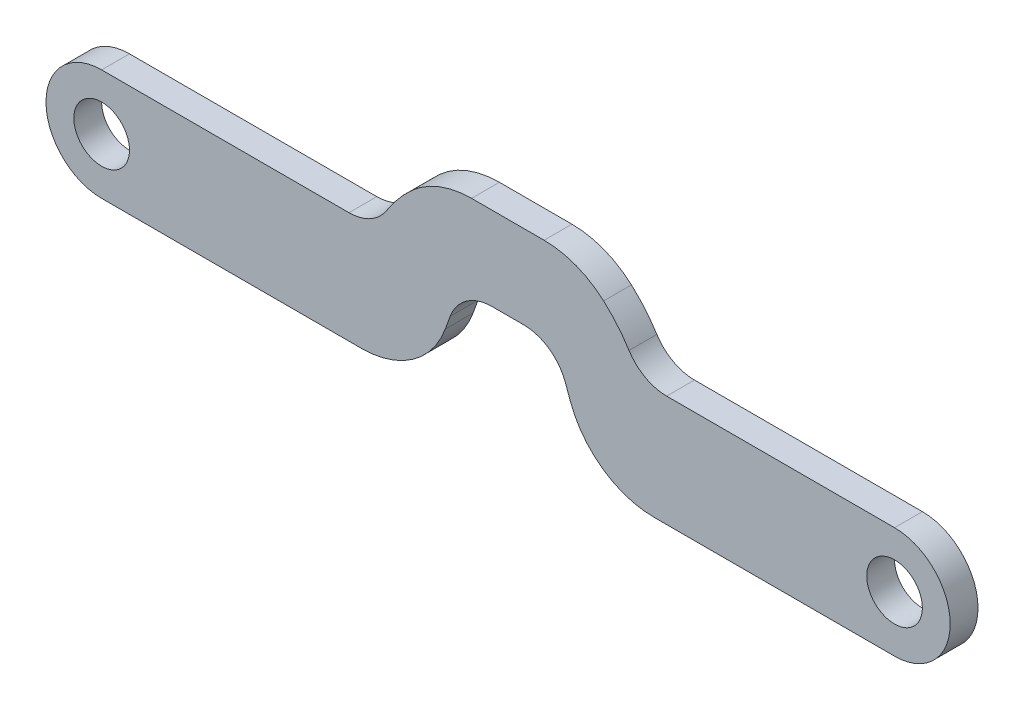
ISO-10303-21;
HEADER;
FILE_DESCRIPTION(('STEP AP214'),'2;1');
FILE_NAME('part.step','',(''),(''),'','','');
FILE_SCHEMA(('AUTOMOTIVE_DESIGN { 1 0 10303 214 1 1 1 1 }'));
ENDSEC;
DATA;
#1=APPLICATION_CONTEXT('core data for automotive mechanical design processes');
#2=APPLICATION_PROTOCOL_DEFINITION('international standard','automotive_design',2000,#1);
#3=PRODUCT_CONTEXT('',#1,'mechanical');
#4=PRODUCT('Part','Part','',(#3));
#5=PRODUCT_RELATED_PRODUCT_CATEGORY('part','',(#4));
#6=PRODUCT_DEFINITION_FORMATION('','',#4);
#7=PRODUCT_DEFINITION_CONTEXT('part definition',#1,'design');
#8=PRODUCT_DEFINITION('design','',#6,#7);
#9=PRODUCT_DEFINITION_SHAPE('','',#8);
#10=(LENGTH_UNIT() NAMED_UNIT(*) SI_UNIT(.MILLI.,.METRE.));
#11=(NAMED_UNIT(*) PLANE_ANGLE_UNIT() SI_UNIT($,.RADIAN.));
#12=(NAMED_UNIT(*) SI_UNIT($,.STERADIAN.) SOLID_ANGLE_UNIT());
#13=UNCERTAINTY_MEASURE_WITH_UNIT(LENGTH_MEASURE(1.E-05),#10,'distance_accuracy_value','');
#14=(GEOMETRIC_REPRESENTATION_CONTEXT(3) GLOBAL_UNCERTAINTY_ASSIGNED_CONTEXT((#13)) GLOBAL_UNIT_ASSIGNED_CONTEXT((#10,
#11,#12)) REPRESENTATION_CONTEXT('',''));
#15=CARTESIAN_POINT('',(0.,0.,0.));
#16=DIRECTION('',(0.,0.,1.));
#17=DIRECTION('',(1.,0.,0.));
#18=AXIS2_PLACEMENT_3D('',#15,#16,#17);
#19=CARTESIAN_POINT('',(0.,-2.,0.5));
#20=DIRECTION('',(0.,1.,0.));
#21=DIRECTION('',(0.,0.,1.));
#22=AXIS2_PLACEMENT_3D('',#19,#20,#21);
#23=PLANE('',#22);
#24=DIRECTION('',(1.,0.,0.));
#25=VECTOR('',#24,1.);
#26=CARTESIAN_POINT('',(0.,-2.,0.5));
#27=LINE('',#26,#25);
#28=CARTESIAN_POINT('',(-8.64341319837332,-2.,0.5));
#29=VERTEX_POINT('',#28);
#30=CARTESIAN_POINT('',(0.,-2.,0.5));
#31=VERTEX_POINT('',#30);
#32=EDGE_CURVE('E177',#29,#31,#27,.T.);
#33=ORIENTED_EDGE('',*,*,#32,.F.);
#34=DIRECTION('',(0.,0.,1.));
#35=VECTOR('',#34,1.);
#36=CARTESIAN_POINT('',(-8.64341319837332,-2.,-0.5));
#37=LINE('',#36,#35);
#38=CARTESIAN_POINT('',(-8.64341319837332,-2.,-0.5));
#39=VERTEX_POINT('',#38);
#40=EDGE_CURVE('E63',#29,#39,#37,.F.);
#41=ORIENTED_EDGE('',*,*,#40,.T.);
#42=DIRECTION('',(1.,0.,0.));
#43=VECTOR('',#42,1.);
#44=CARTESIAN_POINT('',(0.,-2.,-0.5));
#45=LINE('',#44,#43);
#46=CARTESIAN_POINT('',(0.,-2.,-0.5));
#47=VERTEX_POINT('',#46);
#48=EDGE_CURVE('E200',#39,#47,#45,.T.);
#49=ORIENTED_EDGE('',*,*,#48,.T.);
#50=DIRECTION('',(0.,0.,-1.));
#51=VECTOR('',#50,1.);
#52=CARTESIAN_POINT('',(0.,-2.,0.5));
#53=LINE('',#52,#51);
#54=EDGE_CURVE('E195',#31,#47,#53,.T.);
#55=ORIENTED_EDGE('',*,*,#54,.F.);
#56=EDGE_LOOP('',(#33,#41,#49,#55));
#57=FACE_BOUND('',#56,.T.);
#58=ADVANCED_FACE('F40',(#57),#23,.F.);
#59=CARTESIAN_POINT('',(0.,0.,0.5));
#60=DIRECTION('',(0.,0.,1.));
#61=DIRECTION('',(1.,0.,0.));
#62=AXIS2_PLACEMENT_3D('',#59,#60,#61);
#63=PLANE('',#62);
#64=CARTESIAN_POINT('',(-13.9,0.,0.5));
#65=DIRECTION('',(0.,0.,1.));
#66=DIRECTION('',(1.,0.,0.));
#67=AXIS2_PLACEMENT_3D('',#64,#65,#66);
#68=CIRCLE('',#67,5.15);
#69=CARTESIAN_POINT('',(-9.543588377779,2.74666666666667,0.5));
#70=VERTEX_POINT('',#69);
#71=CARTESIAN_POINT('',(-10.4565238577648,3.82948717948718,0.5));
#72=VERTEX_POINT('',#71);
#73=EDGE_CURVE('E354',#70,#72,#68,.T.);
#74=ORIENTED_EDGE('',*,*,#73,.T.);
#75=CARTESIAN_POINT('',(-12.5961595189595,1.45,0.5));
#76=DIRECTION('',(0.,0.,1.));
#77=DIRECTION('',(1.,0.,0.));
#78=AXIS2_PLACEMENT_3D('',#75,#76,#77);
#79=CIRCLE('',#78,3.2);
#80=CARTESIAN_POINT('',(-12.5961595189595,4.65,0.5));
#81=VERTEX_POINT('',#80);
#82=EDGE_CURVE('E253',#72,#81,#79,.T.);
#83=ORIENTED_EDGE('',*,*,#82,.T.);
#84=DIRECTION('',(-1.,0.,0.));
#85=VECTOR('',#84,1.);
#86=CARTESIAN_POINT('',(0.,4.65,0.5));
#87=LINE('',#86,#85);
#88=CARTESIAN_POINT('',(-15.2038404810405,4.65,0.5));
#89=VERTEX_POINT('',#88);
#90=EDGE_CURVE('E346',#81,#89,#87,.T.);
#91=ORIENTED_EDGE('',*,*,#90,.T.);
#92=CARTESIAN_POINT('',(-15.2038404810405,1.45,0.5));
#93=DIRECTION('',(0.,0.,1.));
#94=DIRECTION('',(1.,0.,0.));
#95=AXIS2_PLACEMENT_3D('',#92,#93,#94);
#96=CIRCLE('',#95,3.2);
#97=CARTESIAN_POINT('',(-17.3434761422352,3.82948717948718,0.5));
#98=VERTEX_POINT('',#97);
#99=EDGE_CURVE('E251',#89,#98,#96,.T.);
#100=ORIENTED_EDGE('',*,*,#99,.T.);
#101=CARTESIAN_POINT('',(-18.256411622221,2.74666666666667,0.5));
#102=VERTEX_POINT('',#101);
#103=EDGE_CURVE('E355',#98,#102,#68,.T.);
#104=ORIENTED_EDGE('',*,*,#103,.T.);
#105=CARTESIAN_POINT('',(-19.6098598932023,3.6,0.5));
#106=DIRECTION('',(0.,0.,1.));
#107=DIRECTION('',(1.,0.,0.));
#108=AXIS2_PLACEMENT_3D('',#105,#106,#107);
#109=CIRCLE('',#108,1.6);
#110=CARTESIAN_POINT('',(-19.6098598932023,2.,0.5));
#111=VERTEX_POINT('',#110);
#112=EDGE_CURVE('E243',#102,#111,#109,.F.);
#113=ORIENTED_EDGE('',*,*,#112,.T.);
#114=DIRECTION('',(1.,0.,0.));
#115=VECTOR('',#114,1.);
#116=CARTESIAN_POINT('',(0.,2.,0.5));
#117=LINE('',#116,#115);
#118=CARTESIAN_POINT('',(-28.5003,2.,0.5));
#119=VERTEX_POINT('',#118);
#120=EDGE_CURVE('E294',#119,#111,#117,.T.);
#121=ORIENTED_EDGE('',*,*,#120,.F.);
#122=CARTESIAN_POINT('',(-28.5003,0.,0.5));
#123=DIRECTION('',(0.,0.,1.));
#124=DIRECTION('',(1.,0.,0.));
#125=AXIS2_PLACEMENT_3D('',#122,#123,#124);
#126=CIRCLE('',#125,2.);
#127=CARTESIAN_POINT('',(-28.5003,-2.,0.5));
#128=VERTEX_POINT('',#127);
#129=EDGE_CURVE('E288',#119,#128,#126,.T.);
#130=ORIENTED_EDGE('',*,*,#129,.T.);
#131=CARTESIAN_POINT('',(-19.1565868016267,-2.,0.5));
#132=VERTEX_POINT('',#131);
#133=EDGE_CURVE('E188',#128,#132,#27,.T.);
#134=ORIENTED_EDGE('',*,*,#133,.T.);
#135=CARTESIAN_POINT('',(-19.1565868016267,1.2,0.5));
#136=DIRECTION('',(0.,0.,1.));
#137=DIRECTION('',(1.,0.,0.));
#138=AXIS2_PLACEMENT_3D('',#135,#136,#137);
#139=CIRCLE('',#138,3.2);
#140=CARTESIAN_POINT('',(-16.1495704151118,0.105535541357851,0.5));
#141=VERTEX_POINT('',#140);
#142=EDGE_CURVE('E248',#132,#141,#139,.T.);
#143=ORIENTED_EDGE('',*,*,#142,.T.);
#144=DIRECTION('',(-0.342020143325671,-0.939692620785908,0.));
#145=VECTOR('',#144,1.);
#146=CARTESIAN_POINT('',(-14.2943480143666,5.20271719547167,0.5));
#147=LINE('',#146,#145);
#148=CARTESIAN_POINT('',(-15.9706074564059,0.59723222932107,0.5));
#149=VERTEX_POINT('',#148);
#150=EDGE_CURVE('E429',#149,#141,#147,.T.);
#151=ORIENTED_EDGE('',*,*,#150,.F.);
#152=CARTESIAN_POINT('',(-14.4670992631484,0.0499999999999962,0.5));
#153=DIRECTION('',(0.,0.,1.));
#154=DIRECTION('',(1.,0.,0.));
#155=AXIS2_PLACEMENT_3D('',#152,#153,#154);
#156=CIRCLE('',#155,1.6);
#157=CARTESIAN_POINT('',(-14.4670992631484,1.65,0.5));
#158=VERTEX_POINT('',#157);
#159=EDGE_CURVE('E232',#149,#158,#156,.F.);
#160=ORIENTED_EDGE('',*,*,#159,.T.);
#161=DIRECTION('',(1.,0.,0.));
#162=VECTOR('',#161,1.);
#163=CARTESIAN_POINT('',(0.,1.65,0.5));
#164=LINE('',#163,#162);
#165=CARTESIAN_POINT('',(-13.3329007368516,1.65,0.5));
#166=VERTEX_POINT('',#165);
#167=EDGE_CURVE('E435',#158,#166,#164,.T.);
#168=ORIENTED_EDGE('',*,*,#167,.T.);
#169=CARTESIAN_POINT('',(-13.3329007368516,0.0499999999999964,0.5));
#170=DIRECTION('',(0.,0.,1.));
#171=DIRECTION('',(1.,0.,0.));
#172=AXIS2_PLACEMENT_3D('',#169,#170,#171);
#173=CIRCLE('',#172,1.6);
#174=CARTESIAN_POINT('',(-11.8293925435941,0.597232229321065,0.5));
#175=VERTEX_POINT('',#174);
#176=EDGE_CURVE('E228',#166,#175,#173,.F.);
#177=ORIENTED_EDGE('',*,*,#176,.T.);
#178=DIRECTION('',(0.342020143325668,-0.939692620785909,0.));
#179=VECTOR('',#178,1.);
#180=CARTESIAN_POINT('',(-10.2536697449872,-3.73203057917125,0.5));
#181=LINE('',#180,#179);
#182=CARTESIAN_POINT('',(-11.6504295848882,0.105535541357863,0.5));
#183=VERTEX_POINT('',#182);
#184=EDGE_CURVE('E351',#175,#183,#181,.T.);
#185=ORIENTED_EDGE('',*,*,#184,.T.);
#186=CARTESIAN_POINT('',(-8.64341319837332,1.2,0.5));
#187=DIRECTION('',(0.,0.,1.));
#188=DIRECTION('',(1.,0.,0.));
#189=AXIS2_PLACEMENT_3D('',#186,#187,#188);
#190=CIRCLE('',#189,3.2);
#191=EDGE_CURVE('E186',#183,#29,#190,.T.);
#192=ORIENTED_EDGE('',*,*,#191,.T.);
#193=ORIENTED_EDGE('',*,*,#32,.T.);
#194=CARTESIAN_POINT('',(0.,0.,0.5));
#195=DIRECTION('',(0.,0.,1.));
#196=DIRECTION('',(1.,0.,0.));
#197=AXIS2_PLACEMENT_3D('',#194,#195,#196);
#198=CIRCLE('',#197,2.);
#199=CARTESIAN_POINT('',(0.,2.,0.5));
#200=VERTEX_POINT('',#199);
#201=EDGE_CURVE('E183',#31,#200,#198,.T.);
#202=ORIENTED_EDGE('',*,*,#201,.T.);
#203=CARTESIAN_POINT('',(-8.19014010679772,2.,0.5));
#204=VERTEX_POINT('',#203);
#205=EDGE_CURVE('E198',#204,#200,#117,.T.);
#206=ORIENTED_EDGE('',*,*,#205,.F.);
#207=CARTESIAN_POINT('',(-8.19014010679772,3.6,0.5));
#208=DIRECTION('',(0.,0.,1.));
#209=DIRECTION('',(1.,0.,0.));
#210=AXIS2_PLACEMENT_3D('',#207,#208,#209);
#211=CIRCLE('',#210,1.6);
#212=EDGE_CURVE('E236',#204,#70,#211,.F.);
#213=ORIENTED_EDGE('',*,*,#212,.T.);
#214=EDGE_LOOP('',(#74,#83,#91,#100,#104,#113,#121,#130,#134,#143,#151,#160,#168,#177,#185,#192,
#193,#202,#206,#213));
#215=FACE_BOUND('',#214,.T.);
#216=CARTESIAN_POINT('',(0.,0.,0.5));
#217=DIRECTION('',(0.,0.,1.));
#218=DIRECTION('',(1.,0.,0.));
#219=AXIS2_PLACEMENT_3D('',#216,#217,#218);
#220=CIRCLE('',#219,1.);
#221=CARTESIAN_POINT('',(1.,0.,0.5));
#222=VERTEX_POINT('',#221);
#223=EDGE_CURVE('E301',#222,#222,#220,.T.);
#224=ORIENTED_EDGE('',*,*,#223,.F.);
#225=EDGE_LOOP('',(#224));
#226=FACE_BOUND('',#225,.T.);
#227=CARTESIAN_POINT('',(-28.5003,0.,0.5));
#228=DIRECTION('',(0.,0.,1.));
#229=DIRECTION('',(1.,0.,0.));
#230=AXIS2_PLACEMENT_3D('',#227,#228,#229);
#231=CIRCLE('',#230,0.999999999999998);
#232=CARTESIAN_POINT('',(-27.5003,0.,0.5));
#233=VERTEX_POINT('',#232);
#234=EDGE_CURVE('E298',#233,#233,#231,.T.);
#235=ORIENTED_EDGE('',*,*,#234,.F.);
#236=EDGE_LOOP('',(#235));
#237=FACE_BOUND('',#236,.T.);
#238=ADVANCED_FACE('F180',(#215,#226,#237),#63,.T.);
#239=CARTESIAN_POINT('',(0.,0.,-0.5));
#240=DIRECTION('',(0.,0.,1.));
#241=DIRECTION('',(1.,0.,0.));
#242=AXIS2_PLACEMENT_3D('',#239,#240,#241);
#243=PLANE('',#242);
#244=CARTESIAN_POINT('',(-28.5003,0.,-0.5));
#245=DIRECTION('',(0.,0.,1.));
#246=DIRECTION('',(1.,0.,0.));
#247=AXIS2_PLACEMENT_3D('',#244,#245,#246);
#248=CIRCLE('',#247,0.999999999999998);
#249=CARTESIAN_POINT('',(-27.5003,0.,-0.5));
#250=VERTEX_POINT('',#249);
#251=EDGE_CURVE('E314',#250,#250,#248,.T.);
#252=ORIENTED_EDGE('',*,*,#251,.T.);
#253=EDGE_LOOP('',(#252));
#254=FACE_BOUND('',#253,.T.);
#255=CARTESIAN_POINT('',(0.,0.,-0.5));
#256=DIRECTION('',(0.,0.,1.));
#257=DIRECTION('',(1.,0.,0.));
#258=AXIS2_PLACEMENT_3D('',#255,#256,#257);
#259=CIRCLE('',#258,1.);
#260=CARTESIAN_POINT('',(1.,0.,-0.5));
#261=VERTEX_POINT('',#260);
#262=EDGE_CURVE('E189',#261,#261,#259,.T.);
#263=ORIENTED_EDGE('',*,*,#262,.T.);
#264=EDGE_LOOP('',(#263));
#265=FACE_BOUND('',#264,.T.);
#266=DIRECTION('',(-1.,0.,0.));
#267=VECTOR('',#266,1.);
#268=CARTESIAN_POINT('',(0.,4.65,-0.5));
#269=LINE('',#268,#267);
#270=CARTESIAN_POINT('',(-12.5961595189595,4.65,-0.5));
#271=VERTEX_POINT('',#270);
#272=CARTESIAN_POINT('',(-15.2038404810405,4.65,-0.5));
#273=VERTEX_POINT('',#272);
#274=EDGE_CURVE('E348',#271,#273,#269,.T.);
#275=ORIENTED_EDGE('',*,*,#274,.F.);
#276=CARTESIAN_POINT('',(-12.5961595189595,1.45,-0.5));
#277=DIRECTION('',(0.,0.,1.));
#278=DIRECTION('',(1.,0.,0.));
#279=AXIS2_PLACEMENT_3D('',#276,#277,#278);
#280=CIRCLE('',#279,3.2);
#281=CARTESIAN_POINT('',(-10.4565238577648,3.82948717948718,-0.5));
#282=VERTEX_POINT('',#281);
#283=EDGE_CURVE('E265',#271,#282,#280,.F.);
#284=ORIENTED_EDGE('',*,*,#283,.T.);
#285=CARTESIAN_POINT('',(-13.9,0.,-0.5));
#286=DIRECTION('',(0.,0.,1.));
#287=DIRECTION('',(1.,0.,0.));
#288=AXIS2_PLACEMENT_3D('',#285,#286,#287);
#289=CIRCLE('',#288,5.15);
#290=CARTESIAN_POINT('',(-9.543588377779,2.74666666666667,-0.5));
#291=VERTEX_POINT('',#290);
#292=EDGE_CURVE('E291',#291,#282,#289,.T.);
#293=ORIENTED_EDGE('',*,*,#292,.F.);
#294=CARTESIAN_POINT('',(-8.19014010679772,3.6,-0.5));
#295=DIRECTION('',(0.,0.,1.));
#296=DIRECTION('',(1.,0.,0.));
#297=AXIS2_PLACEMENT_3D('',#294,#295,#296);
#298=CIRCLE('',#297,1.6);
#299=CARTESIAN_POINT('',(-8.19014010679772,2.,-0.5));
#300=VERTEX_POINT('',#299);
#301=EDGE_CURVE('E238',#291,#300,#298,.T.);
#302=ORIENTED_EDGE('',*,*,#301,.T.);
#303=DIRECTION('',(1.,0.,0.));
#304=VECTOR('',#303,1.);
#305=CARTESIAN_POINT('',(0.,2.,-0.5));
#306=LINE('',#305,#304);
#307=CARTESIAN_POINT('',(0.,2.,-0.5));
#308=VERTEX_POINT('',#307);
#309=EDGE_CURVE('E308',#300,#308,#306,.T.);
#310=ORIENTED_EDGE('',*,*,#309,.T.);
#311=CARTESIAN_POINT('',(0.,0.,-0.5));
#312=DIRECTION('',(0.,0.,1.));
#313=DIRECTION('',(1.,0.,0.));
#314=AXIS2_PLACEMENT_3D('',#311,#312,#313);
#315=CIRCLE('',#314,2.);
#316=EDGE_CURVE('E306',#47,#308,#315,.T.);
#317=ORIENTED_EDGE('',*,*,#316,.F.);
#318=ORIENTED_EDGE('',*,*,#48,.F.);
#319=CARTESIAN_POINT('',(-8.64341319837332,1.2,-0.5));
#320=DIRECTION('',(0.,0.,1.));
#321=DIRECTION('',(1.,0.,0.));
#322=AXIS2_PLACEMENT_3D('',#319,#320,#321);
#323=CIRCLE('',#322,3.2);
#324=CARTESIAN_POINT('',(-11.6504295848882,0.105535541357863,-0.5));
#325=VERTEX_POINT('',#324);
#326=EDGE_CURVE('E55',#39,#325,#323,.F.);
#327=ORIENTED_EDGE('',*,*,#326,.T.);
#328=DIRECTION('',(0.342020143325668,-0.939692620785909,0.));
#329=VECTOR('',#328,1.);
#330=CARTESIAN_POINT('',(-10.2536697449872,-3.73203057917125,-0.5));
#331=LINE('',#330,#329);
#332=CARTESIAN_POINT('',(-11.8293925435941,0.597232229321065,-0.5));
#333=VERTEX_POINT('',#332);
#334=EDGE_CURVE('E434',#333,#325,#331,.T.);
#335=ORIENTED_EDGE('',*,*,#334,.F.);
#336=CARTESIAN_POINT('',(-13.3329007368516,0.0499999999999964,-0.5));
#337=DIRECTION('',(0.,0.,1.));
#338=DIRECTION('',(1.,0.,0.));
#339=AXIS2_PLACEMENT_3D('',#336,#337,#338);
#340=CIRCLE('',#339,1.6);
#341=CARTESIAN_POINT('',(-13.3329007368516,1.65,-0.5));
#342=VERTEX_POINT('',#341);
#343=EDGE_CURVE('E230',#333,#342,#340,.T.);
#344=ORIENTED_EDGE('',*,*,#343,.T.);
#345=DIRECTION('',(1.,0.,0.));
#346=VECTOR('',#345,1.);
#347=CARTESIAN_POINT('',(0.,1.65,-0.5));
#348=LINE('',#347,#346);
#349=CARTESIAN_POINT('',(-14.4670992631484,1.65,-0.5));
#350=VERTEX_POINT('',#349);
#351=EDGE_CURVE('E438',#350,#342,#348,.T.);
#352=ORIENTED_EDGE('',*,*,#351,.F.);
#353=CARTESIAN_POINT('',(-14.4670992631484,0.0499999999999962,-0.5));
#354=DIRECTION('',(0.,0.,1.));
#355=DIRECTION('',(1.,0.,0.));
#356=AXIS2_PLACEMENT_3D('',#353,#354,#355);
#357=CIRCLE('',#356,1.6);
#358=CARTESIAN_POINT('',(-15.9706074564059,0.59723222932107,-0.5));
#359=VERTEX_POINT('',#358);
#360=EDGE_CURVE('E234',#350,#359,#357,.T.);
#361=ORIENTED_EDGE('',*,*,#360,.T.);
#362=DIRECTION('',(-0.342020143325671,-0.939692620785908,0.));
#363=VECTOR('',#362,1.);
#364=CARTESIAN_POINT('',(-14.2943480143666,5.20271719547167,-0.5));
#365=LINE('',#364,#363);
#366=CARTESIAN_POINT('',(-16.1495704151118,0.105535541357851,-0.5));
#367=VERTEX_POINT('',#366);
#368=EDGE_CURVE('E337',#359,#367,#365,.T.);
#369=ORIENTED_EDGE('',*,*,#368,.T.);
#370=CARTESIAN_POINT('',(-19.1565868016267,1.2,-0.5));
#371=DIRECTION('',(0.,0.,1.));
#372=DIRECTION('',(1.,0.,0.));
#373=AXIS2_PLACEMENT_3D('',#370,#371,#372);
#374=CIRCLE('',#373,3.2);
#375=CARTESIAN_POINT('',(-19.1565868016267,-2.,-0.5));
#376=VERTEX_POINT('',#375);
#377=EDGE_CURVE('E260',#367,#376,#374,.F.);
#378=ORIENTED_EDGE('',*,*,#377,.T.);
#379=CARTESIAN_POINT('',(-28.5003,-2.,-0.5));
#380=VERTEX_POINT('',#379);
#381=EDGE_CURVE('E281',#380,#376,#45,.T.);
#382=ORIENTED_EDGE('',*,*,#381,.F.);
#383=CARTESIAN_POINT('',(-28.5003,0.,-0.5));
#384=DIRECTION('',(0.,0.,1.));
#385=DIRECTION('',(1.,0.,0.));
#386=AXIS2_PLACEMENT_3D('',#383,#384,#385);
#387=CIRCLE('',#386,2.);
#388=CARTESIAN_POINT('',(-28.5003,2.,-0.5));
#389=VERTEX_POINT('',#388);
#390=EDGE_CURVE('E312',#389,#380,#387,.T.);
#391=ORIENTED_EDGE('',*,*,#390,.F.);
#392=CARTESIAN_POINT('',(-19.6098598932023,2.,-0.5));
#393=VERTEX_POINT('',#392);
#394=EDGE_CURVE('E309',#389,#393,#306,.T.);
#395=ORIENTED_EDGE('',*,*,#394,.T.);
#396=CARTESIAN_POINT('',(-19.6098598932023,3.6,-0.5));
#397=DIRECTION('',(0.,0.,1.));
#398=DIRECTION('',(1.,0.,0.));
#399=AXIS2_PLACEMENT_3D('',#396,#397,#398);
#400=CIRCLE('',#399,1.6);
#401=CARTESIAN_POINT('',(-18.256411622221,2.74666666666667,-0.5));
#402=VERTEX_POINT('',#401);
#403=EDGE_CURVE('E240',#393,#402,#400,.T.);
#404=ORIENTED_EDGE('',*,*,#403,.T.);
#405=CARTESIAN_POINT('',(-17.3434761422352,3.82948717948718,-0.5));
#406=VERTEX_POINT('',#405);
#407=EDGE_CURVE('E333',#406,#402,#289,.T.);
#408=ORIENTED_EDGE('',*,*,#407,.F.);
#409=CARTESIAN_POINT('',(-15.2038404810405,1.45,-0.5));
#410=DIRECTION('',(0.,0.,1.));
#411=DIRECTION('',(1.,0.,0.));
#412=AXIS2_PLACEMENT_3D('',#409,#410,#411);
#413=CIRCLE('',#412,3.2);
#414=EDGE_CURVE('E263',#406,#273,#413,.F.);
#415=ORIENTED_EDGE('',*,*,#414,.T.);
#416=EDGE_LOOP('',(#275,#284,#293,#302,#310,#317,#318,#327,#335,#344,#352,#361,#369,#378,#382,
#391,#395,#404,#408,#415));
#417=FACE_BOUND('',#416,.T.);
#418=ADVANCED_FACE('F325',(#254,#265,#417),#243,.F.);
#419=CARTESIAN_POINT('',(-13.9,0.,0.5));
#420=DIRECTION('',(0.,0.,-1.));
#421=DIRECTION('',(-1.,0.,0.));
#422=AXIS2_PLACEMENT_3D('',#419,#420,#421);
#423=CYLINDRICAL_SURFACE('',#422,5.15);
#424=ORIENTED_EDGE('',*,*,#292,.T.);
#425=DIRECTION('',(0.,0.,-1.));
#426=VECTOR('',#425,1.);
#427=CARTESIAN_POINT('',(-10.4565238577648,3.82948717948718,0.5));
#428=LINE('',#427,#426);
#429=EDGE_CURVE('E245',#282,#72,#428,.F.);
#430=ORIENTED_EDGE('',*,*,#429,.T.);
#431=ORIENTED_EDGE('',*,*,#73,.F.);
#432=DIRECTION('',(0.,0.,-1.));
#433=VECTOR('',#432,1.);
#434=CARTESIAN_POINT('',(-9.543588377779,2.74666666666667,0.5));
#435=LINE('',#434,#433);
#436=EDGE_CURVE('E220',#70,#291,#435,.T.);
#437=ORIENTED_EDGE('',*,*,#436,.T.);
#438=EDGE_LOOP('',(#424,#430,#431,#437));
#439=FACE_BOUND('',#438,.T.);
#440=ADVANCED_FACE('F361',(#439),#423,.T.);
#441=ORIENTED_EDGE('',*,*,#103,.F.);
#442=DIRECTION('',(0.,0.,-1.));
#443=VECTOR('',#442,1.);
#444=CARTESIAN_POINT('',(-17.3434761422352,3.82948717948718,0.5));
#445=LINE('',#444,#443);
#446=EDGE_CURVE('E267',#98,#406,#445,.T.);
#447=ORIENTED_EDGE('',*,*,#446,.T.);
#448=ORIENTED_EDGE('',*,*,#407,.T.);
#449=DIRECTION('',(0.,0.,-1.));
#450=VECTOR('',#449,1.);
#451=CARTESIAN_POINT('',(-18.256411622221,2.74666666666667,0.5));
#452=LINE('',#451,#450);
#453=EDGE_CURVE('E225',#402,#102,#452,.F.);
#454=ORIENTED_EDGE('',*,*,#453,.T.);
#455=EDGE_LOOP('',(#441,#447,#448,#454));
#456=FACE_BOUND('',#455,.T.);
#457=ADVANCED_FACE('F396',(#456),#423,.T.);
#458=CARTESIAN_POINT('',(0.,2.,0.5));
#459=DIRECTION('',(0.,1.,0.));
#460=DIRECTION('',(0.,0.,1.));
#461=AXIS2_PLACEMENT_3D('',#458,#459,#460);
#462=PLANE('',#461);
#463=ORIENTED_EDGE('',*,*,#309,.F.);
#464=DIRECTION('',(0.,0.,-1.));
#465=VECTOR('',#464,1.);
#466=CARTESIAN_POINT('',(-8.19014010679772,2.,0.5));
#467=LINE('',#466,#465);
#468=EDGE_CURVE('E217',#300,#204,#467,.F.);
#469=ORIENTED_EDGE('',*,*,#468,.T.);
#470=ORIENTED_EDGE('',*,*,#205,.T.);
#471=DIRECTION('',(0.,0.,-1.));
#472=VECTOR('',#471,1.);
#473=CARTESIAN_POINT('',(0.,2.,0.5));
#474=LINE('',#473,#472);
#475=EDGE_CURVE('E197',#200,#308,#474,.T.);
#476=ORIENTED_EDGE('',*,*,#475,.T.);
#477=EDGE_LOOP('',(#463,#469,#470,#476));
#478=FACE_BOUND('',#477,.T.);
#479=ADVANCED_FACE('F391',(#478),#462,.T.);
#480=ORIENTED_EDGE('',*,*,#120,.T.);
#481=DIRECTION('',(0.,0.,-1.));
#482=VECTOR('',#481,1.);
#483=CARTESIAN_POINT('',(-19.6098598932023,2.,0.5));
#484=LINE('',#483,#482);
#485=EDGE_CURVE('E222',#111,#393,#484,.T.);
#486=ORIENTED_EDGE('',*,*,#485,.T.);
#487=ORIENTED_EDGE('',*,*,#394,.F.);
#488=DIRECTION('',(0.,0.,-1.));
#489=VECTOR('',#488,1.);
#490=CARTESIAN_POINT('',(-28.5003,2.,0.5));
#491=LINE('',#490,#489);
#492=EDGE_CURVE('E206',#119,#389,#491,.T.);
#493=ORIENTED_EDGE('',*,*,#492,.F.);
#494=EDGE_LOOP('',(#480,#486,#487,#493));
#495=FACE_BOUND('',#494,.T.);
#496=ADVANCED_FACE('F326',(#495),#462,.T.);
#497=ORIENTED_EDGE('',*,*,#381,.T.);
#498=DIRECTION('',(0.,0.,1.));
#499=VECTOR('',#498,1.);
#500=CARTESIAN_POINT('',(-19.1565868016267,-2.,0.5));
#501=LINE('',#500,#499);
#502=EDGE_CURVE('E48',#376,#132,#501,.T.);
#503=ORIENTED_EDGE('',*,*,#502,.T.);
#504=ORIENTED_EDGE('',*,*,#133,.F.);
#505=DIRECTION('',(0.,0.,-1.));
#506=VECTOR('',#505,1.);
#507=CARTESIAN_POINT('',(-28.5003,-2.,0.5));
#508=LINE('',#507,#506);
#509=EDGE_CURVE('E304',#128,#380,#508,.T.);
#510=ORIENTED_EDGE('',*,*,#509,.T.);
#511=EDGE_LOOP('',(#497,#503,#504,#510));
#512=FACE_BOUND('',#511,.T.);
#513=ADVANCED_FACE('F278',(#512),#23,.F.);
#514=CARTESIAN_POINT('',(0.,0.,0.5));
#515=DIRECTION('',(0.,0.,-1.));
#516=DIRECTION('',(-1.,0.,0.));
#517=AXIS2_PLACEMENT_3D('',#514,#515,#516);
#518=CYLINDRICAL_SURFACE('',#517,2.);
#519=ORIENTED_EDGE('',*,*,#316,.T.);
#520=ORIENTED_EDGE('',*,*,#475,.F.);
#521=ORIENTED_EDGE('',*,*,#201,.F.);
#522=ORIENTED_EDGE('',*,*,#54,.T.);
#523=EDGE_LOOP('',(#519,#520,#521,#522));
#524=FACE_BOUND('',#523,.T.);
#525=ADVANCED_FACE('F194',(#524),#518,.T.);
#526=CARTESIAN_POINT('',(-28.5003,0.,0.5));
#527=DIRECTION('',(0.,0.,-1.));
#528=DIRECTION('',(-1.,0.,0.));
#529=AXIS2_PLACEMENT_3D('',#526,#527,#528);
#530=CYLINDRICAL_SURFACE('',#529,0.999999999999998);
#531=ORIENTED_EDGE('',*,*,#234,.T.);
#532=EDGE_LOOP('',(#531));
#533=FACE_BOUND('',#532,.T.);
#534=ORIENTED_EDGE('',*,*,#251,.F.);
#535=EDGE_LOOP('',(#534));
#536=FACE_BOUND('',#535,.T.);
#537=ADVANCED_FACE('F390',(#533,#536),#530,.F.);
#538=CARTESIAN_POINT('',(-28.5003,0.,0.5));
#539=DIRECTION('',(0.,0.,-1.));
#540=DIRECTION('',(-1.,0.,0.));
#541=AXIS2_PLACEMENT_3D('',#538,#539,#540);
#542=CYLINDRICAL_SURFACE('',#541,2.);
#543=ORIENTED_EDGE('',*,*,#390,.T.);
#544=ORIENTED_EDGE('',*,*,#509,.F.);
#545=ORIENTED_EDGE('',*,*,#129,.F.);
#546=ORIENTED_EDGE('',*,*,#492,.T.);
#547=EDGE_LOOP('',(#543,#544,#545,#546));
#548=FACE_BOUND('',#547,.T.);
#549=ADVANCED_FACE('F321',(#548),#542,.T.);
#550=CARTESIAN_POINT('',(0.,0.,0.5));
#551=DIRECTION('',(0.,0.,-1.));
#552=DIRECTION('',(-1.,0.,0.));
#553=AXIS2_PLACEMENT_3D('',#550,#551,#552);
#554=CYLINDRICAL_SURFACE('',#553,1.);
#555=ORIENTED_EDGE('',*,*,#223,.T.);
#556=EDGE_LOOP('',(#555));
#557=FACE_BOUND('',#556,.T.);
#558=ORIENTED_EDGE('',*,*,#262,.F.);
#559=EDGE_LOOP('',(#558));
#560=FACE_BOUND('',#559,.T.);
#561=ADVANCED_FACE('F401',(#557,#560),#554,.F.);
#562=CARTESIAN_POINT('',(0.,4.65,-0.5));
#563=DIRECTION('',(0.,1.,0.));
#564=DIRECTION('',(0.,0.,1.));
#565=AXIS2_PLACEMENT_3D('',#562,#563,#564);
#566=PLANE('',#565);
#567=ORIENTED_EDGE('',*,*,#90,.F.);
#568=DIRECTION('',(0.,0.,1.));
#569=VECTOR('',#568,1.);
#570=CARTESIAN_POINT('',(-12.5961595189595,4.65,-0.5));
#571=LINE('',#570,#569);
#572=EDGE_CURVE('E258',#81,#271,#571,.F.);
#573=ORIENTED_EDGE('',*,*,#572,.T.);
#574=ORIENTED_EDGE('',*,*,#274,.T.);
#575=DIRECTION('',(0.,0.,1.));
#576=VECTOR('',#575,1.);
#577=CARTESIAN_POINT('',(-15.2038404810405,4.65,0.5));
#578=LINE('',#577,#576);
#579=EDGE_CURVE('E255',#273,#89,#578,.T.);
#580=ORIENTED_EDGE('',*,*,#579,.T.);
#581=EDGE_LOOP('',(#567,#573,#574,#580));
#582=FACE_BOUND('',#581,.T.);
#583=ADVANCED_FACE('F345',(#582),#566,.T.);
#584=CARTESIAN_POINT('',(-14.2943480143666,5.20271719547167,-0.5));
#585=DIRECTION('',(-0.939692620785908,0.342020143325671,0.));
#586=DIRECTION('',(-0.342020143325671,-0.939692620785908,0.));
#587=AXIS2_PLACEMENT_3D('',#584,#585,#586);
#588=PLANE('',#587);
#589=ORIENTED_EDGE('',*,*,#150,.T.);
#590=DIRECTION('',(0.,0.,1.));
#591=VECTOR('',#590,1.);
#592=CARTESIAN_POINT('',(-16.1495704151118,0.105535541357851,-0.5));
#593=LINE('',#592,#591);
#594=EDGE_CURVE('E11',#141,#367,#593,.F.);
#595=ORIENTED_EDGE('',*,*,#594,.T.);
#596=ORIENTED_EDGE('',*,*,#368,.F.);
#597=DIRECTION('',(0.,0.,1.));
#598=VECTOR('',#597,1.);
#599=CARTESIAN_POINT('',(-15.9706074564059,0.59723222932107,-0.5));
#600=LINE('',#599,#598);
#601=EDGE_CURVE('E214',#359,#149,#600,.T.);
#602=ORIENTED_EDGE('',*,*,#601,.T.);
#603=EDGE_LOOP('',(#589,#595,#596,#602));
#604=FACE_BOUND('',#603,.T.);
#605=ADVANCED_FACE('F415',(#604),#588,.F.);
#606=CARTESIAN_POINT('',(0.,1.65,-0.5));
#607=DIRECTION('',(0.,-1.,0.));
#608=DIRECTION('',(0.,0.,-1.));
#609=AXIS2_PLACEMENT_3D('',#606,#607,#608);
#610=PLANE('',#609);
#611=ORIENTED_EDGE('',*,*,#351,.T.);
#612=DIRECTION('',(0.,0.,1.));
#613=VECTOR('',#612,1.);
#614=CARTESIAN_POINT('',(-13.3329007368516,1.65,0.5));
#615=LINE('',#614,#613);
#616=EDGE_CURVE('E204',#342,#166,#615,.T.);
#617=ORIENTED_EDGE('',*,*,#616,.T.);
#618=ORIENTED_EDGE('',*,*,#167,.F.);
#619=DIRECTION('',(0.,0.,1.));
#620=VECTOR('',#619,1.);
#621=CARTESIAN_POINT('',(-14.4670992631484,1.65,-0.5));
#622=LINE('',#621,#620);
#623=EDGE_CURVE('E202',#158,#350,#622,.F.);
#624=ORIENTED_EDGE('',*,*,#623,.T.);
#625=EDGE_LOOP('',(#611,#617,#618,#624));
#626=FACE_BOUND('',#625,.T.);
#627=ADVANCED_FACE('F420',(#626),#610,.T.);
#628=CARTESIAN_POINT('',(-10.2536697449872,-3.73203057917125,-0.5));
#629=DIRECTION('',(-0.939692620785909,-0.342020143325668,0.));
#630=DIRECTION('',(0.342020143325668,-0.939692620785909,0.));
#631=AXIS2_PLACEMENT_3D('',#628,#629,#630);
#632=PLANE('',#631);
#633=ORIENTED_EDGE('',*,*,#334,.T.);
#634=DIRECTION('',(0.,0.,1.));
#635=VECTOR('',#634,1.);
#636=CARTESIAN_POINT('',(-11.6504295848882,0.105535541357863,0.5));
#637=LINE('',#636,#635);
#638=EDGE_CURVE('E269',#325,#183,#637,.T.);
#639=ORIENTED_EDGE('',*,*,#638,.T.);
#640=ORIENTED_EDGE('',*,*,#184,.F.);
#641=DIRECTION('',(0.,0.,1.));
#642=VECTOR('',#641,1.);
#643=CARTESIAN_POINT('',(-11.8293925435941,0.597232229321065,-0.5));
#644=LINE('',#643,#642);
#645=EDGE_CURVE('E212',#175,#333,#644,.F.);
#646=ORIENTED_EDGE('',*,*,#645,.T.);
#647=EDGE_LOOP('',(#633,#639,#640,#646));
#648=FACE_BOUND('',#647,.T.);
#649=ADVANCED_FACE('F416',(#648),#632,.T.);
#650=CARTESIAN_POINT('',(-13.3329007368516,0.0499999999999964,-0.5));
#651=DIRECTION('',(0.,0.,-1.));
#652=DIRECTION('',(-1.,0.,0.));
#653=AXIS2_PLACEMENT_3D('',#650,#651,#652);
#654=CYLINDRICAL_SURFACE('',#653,1.6);
#655=ORIENTED_EDGE('',*,*,#343,.F.);
#656=ORIENTED_EDGE('',*,*,#645,.F.);
#657=ORIENTED_EDGE('',*,*,#176,.F.);
#658=ORIENTED_EDGE('',*,*,#616,.F.);
#659=EDGE_LOOP('',(#655,#656,#657,#658));
#660=FACE_BOUND('',#659,.T.);
#661=ADVANCED_FACE('F419',(#660),#654,.F.);
#662=CARTESIAN_POINT('',(-14.4670992631484,0.0499999999999962,-0.5));
#663=DIRECTION('',(0.,0.,1.));
#664=DIRECTION('',(1.,0.,0.));
#665=AXIS2_PLACEMENT_3D('',#662,#663,#664);
#666=CYLINDRICAL_SURFACE('',#665,1.6);
#667=ORIENTED_EDGE('',*,*,#360,.F.);
#668=ORIENTED_EDGE('',*,*,#623,.F.);
#669=ORIENTED_EDGE('',*,*,#159,.F.);
#670=ORIENTED_EDGE('',*,*,#601,.F.);
#671=EDGE_LOOP('',(#667,#668,#669,#670));
#672=FACE_BOUND('',#671,.T.);
#673=ADVANCED_FACE('F451',(#672),#666,.F.);
#674=CARTESIAN_POINT('',(-8.19014010679772,3.6,0.5));
#675=DIRECTION('',(0.,0.,-1.));
#676=DIRECTION('',(-1.,0.,0.));
#677=AXIS2_PLACEMENT_3D('',#674,#675,#676);
#678=CYLINDRICAL_SURFACE('',#677,1.6);
#679=ORIENTED_EDGE('',*,*,#301,.F.);
#680=ORIENTED_EDGE('',*,*,#436,.F.);
#681=ORIENTED_EDGE('',*,*,#212,.F.);
#682=ORIENTED_EDGE('',*,*,#468,.F.);
#683=EDGE_LOOP('',(#679,#680,#681,#682));
#684=FACE_BOUND('',#683,.T.);
#685=ADVANCED_FACE('F375',(#684),#678,.F.);
#686=CARTESIAN_POINT('',(-19.6098598932023,3.6,0.5));
#687=DIRECTION('',(0.,0.,-1.));
#688=DIRECTION('',(-1.,0.,0.));
#689=AXIS2_PLACEMENT_3D('',#686,#687,#688);
#690=CYLINDRICAL_SURFACE('',#689,1.6);
#691=ORIENTED_EDGE('',*,*,#112,.F.);
#692=ORIENTED_EDGE('',*,*,#453,.F.);
#693=ORIENTED_EDGE('',*,*,#403,.F.);
#694=ORIENTED_EDGE('',*,*,#485,.F.);
#695=EDGE_LOOP('',(#691,#692,#693,#694));
#696=FACE_BOUND('',#695,.T.);
#697=ADVANCED_FACE('F330',(#696),#690,.F.);
#698=CARTESIAN_POINT('',(-12.5961595189595,1.45,0.5));
#699=DIRECTION('',(0.,0.,-1.));
#700=DIRECTION('',(-1.,0.,0.));
#701=AXIS2_PLACEMENT_3D('',#698,#699,#700);
#702=CYLINDRICAL_SURFACE('',#701,3.2);
#703=ORIENTED_EDGE('',*,*,#283,.F.);
#704=ORIENTED_EDGE('',*,*,#572,.F.);
#705=ORIENTED_EDGE('',*,*,#82,.F.);
#706=ORIENTED_EDGE('',*,*,#429,.F.);
#707=EDGE_LOOP('',(#703,#704,#705,#706));
#708=FACE_BOUND('',#707,.T.);
#709=ADVANCED_FACE('F366',(#708),#702,.T.);
#710=CARTESIAN_POINT('',(-15.2038404810405,1.45,0.5));
#711=DIRECTION('',(0.,0.,-1.));
#712=DIRECTION('',(-1.,0.,0.));
#713=AXIS2_PLACEMENT_3D('',#710,#711,#712);
#714=CYLINDRICAL_SURFACE('',#713,3.2);
#715=ORIENTED_EDGE('',*,*,#414,.F.);
#716=ORIENTED_EDGE('',*,*,#446,.F.);
#717=ORIENTED_EDGE('',*,*,#99,.F.);
#718=ORIENTED_EDGE('',*,*,#579,.F.);
#719=EDGE_LOOP('',(#715,#716,#717,#718));
#720=FACE_BOUND('',#719,.T.);
#721=ADVANCED_FACE('F341',(#720),#714,.T.);
#722=CARTESIAN_POINT('',(-8.64341319837332,1.2,-0.5));
#723=DIRECTION('',(0.,0.,-1.));
#724=DIRECTION('',(-1.,0.,0.));
#725=AXIS2_PLACEMENT_3D('',#722,#723,#724);
#726=CYLINDRICAL_SURFACE('',#725,3.2);
#727=ORIENTED_EDGE('',*,*,#326,.F.);
#728=ORIENTED_EDGE('',*,*,#40,.F.);
#729=ORIENTED_EDGE('',*,*,#191,.F.);
#730=ORIENTED_EDGE('',*,*,#638,.F.);
#731=EDGE_LOOP('',(#727,#728,#729,#730));
#732=FACE_BOUND('',#731,.T.);
#733=ADVANCED_FACE('F373',(#732),#726,.T.);
#734=CARTESIAN_POINT('',(-19.1565868016267,1.2,0.5));
#735=DIRECTION('',(0.,0.,1.));
#736=DIRECTION('',(1.,0.,0.));
#737=AXIS2_PLACEMENT_3D('',#734,#735,#736);
#738=CYLINDRICAL_SURFACE('',#737,3.2);
#739=ORIENTED_EDGE('',*,*,#377,.F.);
#740=ORIENTED_EDGE('',*,*,#594,.F.);
#741=ORIENTED_EDGE('',*,*,#142,.F.);
#742=ORIENTED_EDGE('',*,*,#502,.F.);
#743=EDGE_LOOP('',(#739,#740,#741,#742));
#744=FACE_BOUND('',#743,.T.);
#745=ADVANCED_FACE('F42',(#744),#738,.T.);
#746=CLOSED_SHELL('',(#58,#238,#418,#440,#457,#479,#496,#513,#525,#537,#549,#561,#583,#605,#627,
#649,#661,#673,#685,#697,#709,#721,#733,#745));
#747=MANIFOLD_SOLID_BREP('B2',#746);
#748=ADVANCED_BREP_SHAPE_REPRESENTATION('',(#18,#747),#14);
#749=SHAPE_DEFINITION_REPRESENTATION(#9,#748);
ENDSEC;
END-ISO-10303-21;
